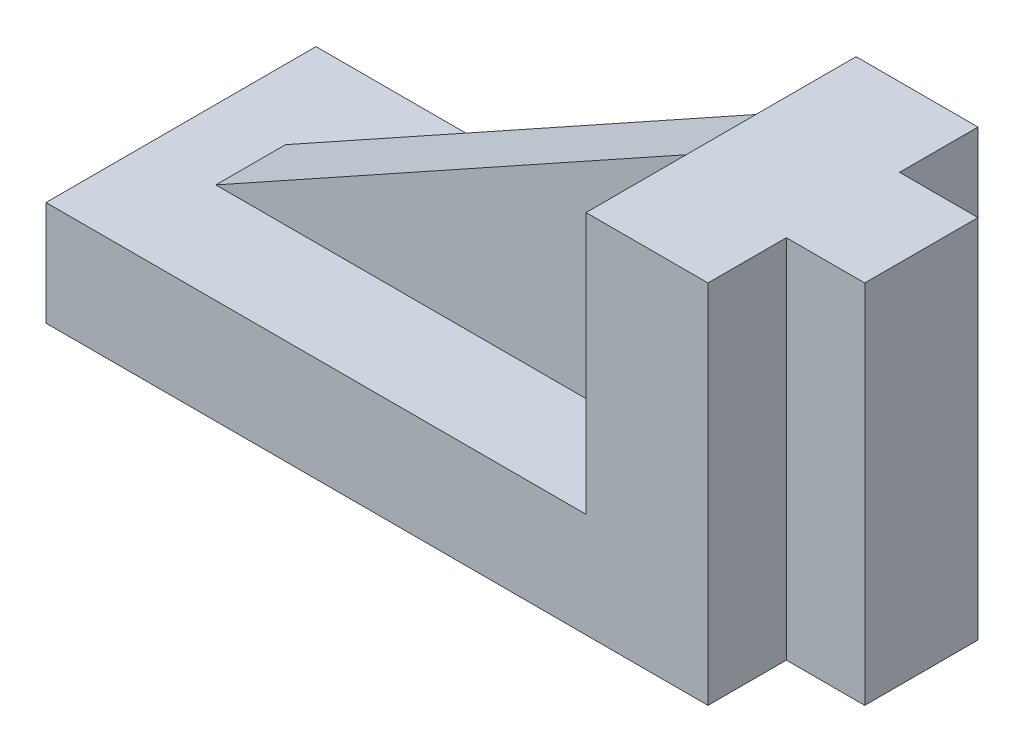
ISO-10303-21;
HEADER;
FILE_DESCRIPTION(('STEP AP214'),'2;1');
FILE_NAME('part.step','',(''),(''),'','','');
FILE_SCHEMA(('AUTOMOTIVE_DESIGN { 1 0 10303 214 1 1 1 1 }'));
ENDSEC;
DATA;
#1=APPLICATION_CONTEXT('core data for automotive mechanical design processes');
#2=APPLICATION_PROTOCOL_DEFINITION('international standard','automotive_design',2000,#1);
#3=PRODUCT_CONTEXT('',#1,'mechanical');
#4=PRODUCT('Part','Part','',(#3));
#5=PRODUCT_RELATED_PRODUCT_CATEGORY('part','',(#4));
#6=PRODUCT_DEFINITION_FORMATION('','',#4);
#7=PRODUCT_DEFINITION_CONTEXT('part definition',#1,'design');
#8=PRODUCT_DEFINITION('design','',#6,#7);
#9=PRODUCT_DEFINITION_SHAPE('','',#8);
#10=(LENGTH_UNIT() NAMED_UNIT(*) SI_UNIT(.MILLI.,.METRE.));
#11=(NAMED_UNIT(*) PLANE_ANGLE_UNIT() SI_UNIT($,.RADIAN.));
#12=(NAMED_UNIT(*) SI_UNIT($,.STERADIAN.) SOLID_ANGLE_UNIT());
#13=UNCERTAINTY_MEASURE_WITH_UNIT(LENGTH_MEASURE(1.E-05),#10,'distance_accuracy_value','');
#14=(GEOMETRIC_REPRESENTATION_CONTEXT(3) GLOBAL_UNCERTAINTY_ASSIGNED_CONTEXT((#13)) GLOBAL_UNIT_ASSIGNED_CONTEXT((#10,
#11,#12)) REPRESENTATION_CONTEXT('',''));
#15=CARTESIAN_POINT('',(0.,0.,0.));
#16=DIRECTION('',(0.,0.,1.));
#17=DIRECTION('',(1.,0.,0.));
#18=AXIS2_PLACEMENT_3D('',#15,#16,#17);
#19=CARTESIAN_POINT('',(76.,42.,15.5));
#20=DIRECTION('',(-1.,0.,0.));
#21=DIRECTION('',(0.,0.,1.));
#22=AXIS2_PLACEMENT_3D('',#19,#20,#21);
#23=PLANE('',#22);
#24=DIRECTION('',(0.,1.,0.));
#25=VECTOR('',#24,1.);
#26=CARTESIAN_POINT('',(76.,0.,-6.5));
#27=LINE('',#26,#25);
#28=CARTESIAN_POINT('',(76.,0.,-6.5));
#29=VERTEX_POINT('',#28);
#30=CARTESIAN_POINT('',(76.,42.,-6.5));
#31=VERTEX_POINT('',#30);
#32=EDGE_CURVE('E260',#29,#31,#27,.T.);
#33=ORIENTED_EDGE('',*,*,#32,.F.);
#34=DIRECTION('',(0.,0.,-1.));
#35=VECTOR('',#34,1.);
#36=CARTESIAN_POINT('',(76.,0.,15.5));
#37=LINE('',#36,#35);
#38=CARTESIAN_POINT('',(76.,0.,-15.5));
#39=VERTEX_POINT('',#38);
#40=EDGE_CURVE('E48',#29,#39,#37,.T.);
#41=ORIENTED_EDGE('',*,*,#40,.T.);
#42=DIRECTION('',(0.,1.,0.));
#43=VECTOR('',#42,1.);
#44=CARTESIAN_POINT('',(76.,42.,-15.5));
#45=LINE('',#44,#43);
#46=CARTESIAN_POINT('',(76.,42.,-15.5));
#47=VERTEX_POINT('',#46);
#48=EDGE_CURVE('E195',#39,#47,#45,.T.);
#49=ORIENTED_EDGE('',*,*,#48,.T.);
#50=DIRECTION('',(0.,0.,-1.));
#51=VECTOR('',#50,1.);
#52=CARTESIAN_POINT('',(76.,42.,15.5));
#53=LINE('',#52,#51);
#54=EDGE_CURVE('E224',#31,#47,#53,.T.);
#55=ORIENTED_EDGE('',*,*,#54,.F.);
#56=EDGE_LOOP('',(#33,#41,#49,#55));
#57=FACE_BOUND('',#56,.T.);
#58=ADVANCED_FACE('F39',(#57),#23,.F.);
#59=CARTESIAN_POINT('',(62.,12.,15.5));
#60=DIRECTION('',(1.,0.,0.));
#61=DIRECTION('',(0.,0.,-1.));
#62=AXIS2_PLACEMENT_3D('',#59,#60,#61);
#63=PLANE('',#62);
#64=DIRECTION('',(0.,1.,0.));
#65=VECTOR('',#64,1.);
#66=CARTESIAN_POINT('',(62.,42.,-4.));
#67=LINE('',#66,#65);
#68=CARTESIAN_POINT('',(62.,12.,-4.));
#69=VERTEX_POINT('',#68);
#70=CARTESIAN_POINT('',(62.,42.,-4.));
#71=VERTEX_POINT('',#70);
#72=EDGE_CURVE('E63',#69,#71,#67,.T.);
#73=ORIENTED_EDGE('',*,*,#72,.T.);
#74=DIRECTION('',(0.,0.,-1.));
#75=VECTOR('',#74,1.);
#76=CARTESIAN_POINT('',(62.,42.,15.5));
#77=LINE('',#76,#75);
#78=CARTESIAN_POINT('',(62.,42.,-15.5));
#79=VERTEX_POINT('',#78);
#80=EDGE_CURVE('E220',#71,#79,#77,.T.);
#81=ORIENTED_EDGE('',*,*,#80,.T.);
#82=DIRECTION('',(0.,-1.,0.));
#83=VECTOR('',#82,1.);
#84=CARTESIAN_POINT('',(62.,12.,-15.5));
#85=LINE('',#84,#83);
#86=CARTESIAN_POINT('',(62.,12.,-15.5));
#87=VERTEX_POINT('',#86);
#88=EDGE_CURVE('E203',#79,#87,#85,.T.);
#89=ORIENTED_EDGE('',*,*,#88,.T.);
#90=DIRECTION('',(0.,0.,-1.));
#91=VECTOR('',#90,1.);
#92=CARTESIAN_POINT('',(62.,12.,15.5));
#93=LINE('',#92,#91);
#94=EDGE_CURVE('E215',#69,#87,#93,.T.);
#95=ORIENTED_EDGE('',*,*,#94,.F.);
#96=EDGE_LOOP('',(#73,#81,#89,#95));
#97=FACE_BOUND('',#96,.T.);
#98=ADVANCED_FACE('F245',(#97),#63,.F.);
#99=CARTESIAN_POINT('',(76.,0.,15.5));
#100=DIRECTION('',(0.,1.,0.));
#101=DIRECTION('',(-1.,0.,0.));
#102=AXIS2_PLACEMENT_3D('',#99,#100,#101);
#103=PLANE('',#102);
#104=DIRECTION('',(1.,0.,0.));
#105=VECTOR('',#104,1.);
#106=CARTESIAN_POINT('',(76.,0.,-15.5));
#107=LINE('',#106,#105);
#108=CARTESIAN_POINT('',(0.,0.,-15.5));
#109=VERTEX_POINT('',#108);
#110=EDGE_CURVE('E192',#109,#39,#107,.T.);
#111=ORIENTED_EDGE('',*,*,#110,.T.);
#112=ORIENTED_EDGE('',*,*,#40,.F.);
#113=DIRECTION('',(-1.,0.,0.));
#114=VECTOR('',#113,1.);
#115=CARTESIAN_POINT('',(76.,0.,-6.5));
#116=LINE('',#115,#114);
#117=CARTESIAN_POINT('',(85.,0.,-6.5));
#118=VERTEX_POINT('',#117);
#119=EDGE_CURVE('E143',#118,#29,#116,.T.);
#120=ORIENTED_EDGE('',*,*,#119,.F.);
#121=DIRECTION('',(0.,0.,-1.));
#122=VECTOR('',#121,1.);
#123=CARTESIAN_POINT('',(85.,0.,-6.5));
#124=LINE('',#123,#122);
#125=CARTESIAN_POINT('',(85.,0.,6.5));
#126=VERTEX_POINT('',#125);
#127=EDGE_CURVE('E152',#126,#118,#124,.T.);
#128=ORIENTED_EDGE('',*,*,#127,.F.);
#129=DIRECTION('',(1.,0.,0.));
#130=VECTOR('',#129,1.);
#131=CARTESIAN_POINT('',(76.,0.,6.5));
#132=LINE('',#131,#130);
#133=CARTESIAN_POINT('',(76.,0.,6.5));
#134=VERTEX_POINT('',#133);
#135=EDGE_CURVE('E137',#134,#126,#132,.T.);
#136=ORIENTED_EDGE('',*,*,#135,.F.);
#137=CARTESIAN_POINT('',(76.,0.,15.5));
#138=VERTEX_POINT('',#137);
#139=EDGE_CURVE('E11',#138,#134,#37,.T.);
#140=ORIENTED_EDGE('',*,*,#139,.F.);
#141=DIRECTION('',(1.,0.,0.));
#142=VECTOR('',#141,1.);
#143=CARTESIAN_POINT('',(76.,0.,15.5));
#144=LINE('',#143,#142);
#145=CARTESIAN_POINT('',(0.,0.,15.5));
#146=VERTEX_POINT('',#145);
#147=EDGE_CURVE('E164',#146,#138,#144,.T.);
#148=ORIENTED_EDGE('',*,*,#147,.F.);
#149=DIRECTION('',(0.,0.,-1.));
#150=VECTOR('',#149,1.);
#151=CARTESIAN_POINT('',(0.,0.,15.5));
#152=LINE('',#151,#150);
#153=EDGE_CURVE('E191',#146,#109,#152,.T.);
#154=ORIENTED_EDGE('',*,*,#153,.T.);
#155=EDGE_LOOP('',(#111,#112,#120,#128,#136,#140,#148,#154));
#156=FACE_BOUND('',#155,.T.);
#157=ADVANCED_FACE('F41',(#156),#103,.F.);
#158=ORIENTED_EDGE('',*,*,#139,.T.);
#159=DIRECTION('',(0.,1.,0.));
#160=VECTOR('',#159,1.);
#161=CARTESIAN_POINT('',(76.,0.,6.5));
#162=LINE('',#161,#160);
#163=CARTESIAN_POINT('',(76.,42.,6.5));
#164=VERTEX_POINT('',#163);
#165=EDGE_CURVE('E134',#134,#164,#162,.T.);
#166=ORIENTED_EDGE('',*,*,#165,.T.);
#167=CARTESIAN_POINT('',(76.,42.,15.5));
#168=VERTEX_POINT('',#167);
#169=EDGE_CURVE('E159',#168,#164,#53,.T.);
#170=ORIENTED_EDGE('',*,*,#169,.F.);
#171=DIRECTION('',(0.,1.,0.));
#172=VECTOR('',#171,1.);
#173=CARTESIAN_POINT('',(76.,42.,15.5));
#174=LINE('',#173,#172);
#175=EDGE_CURVE('E157',#138,#168,#174,.T.);
#176=ORIENTED_EDGE('',*,*,#175,.F.);
#177=EDGE_LOOP('',(#158,#166,#170,#176));
#178=FACE_BOUND('',#177,.T.);
#179=ADVANCED_FACE('F156',(#178),#23,.F.);
#180=CARTESIAN_POINT('',(62.,42.,15.5));
#181=DIRECTION('',(0.,-1.,0.));
#182=DIRECTION('',(0.,0.,-1.));
#183=AXIS2_PLACEMENT_3D('',#180,#181,#182);
#184=PLANE('',#183);
#185=DIRECTION('',(-1.,0.,0.));
#186=VECTOR('',#185,1.);
#187=CARTESIAN_POINT('',(62.,42.,-15.5));
#188=LINE('',#187,#186);
#189=EDGE_CURVE('E199',#47,#79,#188,.T.);
#190=ORIENTED_EDGE('',*,*,#189,.T.);
#191=ORIENTED_EDGE('',*,*,#80,.F.);
#192=DIRECTION('',(0.,0.,-1.));
#193=VECTOR('',#192,1.);
#194=CARTESIAN_POINT('',(62.,42.,4.));
#195=LINE('',#194,#193);
#196=CARTESIAN_POINT('',(62.,42.,4.));
#197=VERTEX_POINT('',#196);
#198=EDGE_CURVE('E178',#197,#71,#195,.T.);
#199=ORIENTED_EDGE('',*,*,#198,.F.);
#200=CARTESIAN_POINT('',(62.,42.,15.5));
#201=VERTEX_POINT('',#200);
#202=EDGE_CURVE('E221',#201,#197,#77,.T.);
#203=ORIENTED_EDGE('',*,*,#202,.F.);
#204=DIRECTION('',(-1.,0.,0.));
#205=VECTOR('',#204,1.);
#206=CARTESIAN_POINT('',(62.,42.,15.5));
#207=LINE('',#206,#205);
#208=EDGE_CURVE('E163',#168,#201,#207,.T.);
#209=ORIENTED_EDGE('',*,*,#208,.F.);
#210=ORIENTED_EDGE('',*,*,#169,.T.);
#211=DIRECTION('',(1.,0.,0.));
#212=VECTOR('',#211,1.);
#213=CARTESIAN_POINT('',(76.,42.,6.5));
#214=LINE('',#213,#212);
#215=CARTESIAN_POINT('',(85.,42.,6.5));
#216=VERTEX_POINT('',#215);
#217=EDGE_CURVE('E55',#164,#216,#214,.T.);
#218=ORIENTED_EDGE('',*,*,#217,.T.);
#219=DIRECTION('',(0.,0.,-1.));
#220=VECTOR('',#219,1.);
#221=CARTESIAN_POINT('',(85.,42.,-6.5));
#222=LINE('',#221,#220);
#223=CARTESIAN_POINT('',(85.,42.,-6.5));
#224=VERTEX_POINT('',#223);
#225=EDGE_CURVE('E293',#216,#224,#222,.T.);
#226=ORIENTED_EDGE('',*,*,#225,.T.);
#227=DIRECTION('',(-1.,0.,0.));
#228=VECTOR('',#227,1.);
#229=CARTESIAN_POINT('',(76.,42.,-6.5));
#230=LINE('',#229,#228);
#231=EDGE_CURVE('E154',#224,#31,#230,.T.);
#232=ORIENTED_EDGE('',*,*,#231,.T.);
#233=ORIENTED_EDGE('',*,*,#54,.T.);
#234=EDGE_LOOP('',(#190,#191,#199,#203,#209,#210,#218,#226,#232,#233));
#235=FACE_BOUND('',#234,.T.);
#236=ADVANCED_FACE('F231',(#235),#184,.F.);
#237=ORIENTED_EDGE('',*,*,#202,.T.);
#238=DIRECTION('',(0.,1.,0.));
#239=VECTOR('',#238,1.);
#240=CARTESIAN_POINT('',(62.,42.,4.));
#241=LINE('',#240,#239);
#242=CARTESIAN_POINT('',(62.,12.,4.));
#243=VERTEX_POINT('',#242);
#244=EDGE_CURVE('E278',#243,#197,#241,.T.);
#245=ORIENTED_EDGE('',*,*,#244,.F.);
#246=CARTESIAN_POINT('',(62.,12.,15.5));
#247=VERTEX_POINT('',#246);
#248=EDGE_CURVE('E216',#247,#243,#93,.T.);
#249=ORIENTED_EDGE('',*,*,#248,.F.);
#250=DIRECTION('',(0.,-1.,0.));
#251=VECTOR('',#250,1.);
#252=CARTESIAN_POINT('',(62.,12.,15.5));
#253=LINE('',#252,#251);
#254=EDGE_CURVE('E183',#201,#247,#253,.T.);
#255=ORIENTED_EDGE('',*,*,#254,.F.);
#256=EDGE_LOOP('',(#237,#245,#249,#255));
#257=FACE_BOUND('',#256,.T.);
#258=ADVANCED_FACE('F321',(#257),#63,.F.);
#259=CARTESIAN_POINT('',(0.,12.,15.5));
#260=DIRECTION('',(0.,-1.,0.));
#261=DIRECTION('',(0.,0.,-1.));
#262=AXIS2_PLACEMENT_3D('',#259,#260,#261);
#263=PLANE('',#262);
#264=ORIENTED_EDGE('',*,*,#248,.T.);
#265=DIRECTION('',(1.,0.,0.));
#266=VECTOR('',#265,1.);
#267=CARTESIAN_POINT('',(62.,12.,4.));
#268=LINE('',#267,#266);
#269=CARTESIAN_POINT('',(8.,12.,4.));
#270=VERTEX_POINT('',#269);
#271=EDGE_CURVE('E273',#270,#243,#268,.T.);
#272=ORIENTED_EDGE('',*,*,#271,.F.);
#273=DIRECTION('',(0.,0.,-1.));
#274=VECTOR('',#273,1.);
#275=CARTESIAN_POINT('',(8.,12.,4.));
#276=LINE('',#275,#274);
#277=CARTESIAN_POINT('',(8.,12.,-4.));
#278=VERTEX_POINT('',#277);
#279=EDGE_CURVE('E255',#270,#278,#276,.T.);
#280=ORIENTED_EDGE('',*,*,#279,.T.);
#281=DIRECTION('',(1.,0.,0.));
#282=VECTOR('',#281,1.);
#283=CARTESIAN_POINT('',(62.,12.,-4.));
#284=LINE('',#283,#282);
#285=EDGE_CURVE('E253',#278,#69,#284,.T.);
#286=ORIENTED_EDGE('',*,*,#285,.T.);
#287=ORIENTED_EDGE('',*,*,#94,.T.);
#288=DIRECTION('',(-1.,0.,0.));
#289=VECTOR('',#288,1.);
#290=CARTESIAN_POINT('',(0.,12.,-15.5));
#291=LINE('',#290,#289);
#292=CARTESIAN_POINT('',(0.,12.,-15.5));
#293=VERTEX_POINT('',#292);
#294=EDGE_CURVE('E175',#87,#293,#291,.T.);
#295=ORIENTED_EDGE('',*,*,#294,.T.);
#296=DIRECTION('',(0.,0.,-1.));
#297=VECTOR('',#296,1.);
#298=CARTESIAN_POINT('',(0.,12.,15.5));
#299=LINE('',#298,#297);
#300=CARTESIAN_POINT('',(0.,12.,15.5));
#301=VERTEX_POINT('',#300);
#302=EDGE_CURVE('E211',#301,#293,#299,.T.);
#303=ORIENTED_EDGE('',*,*,#302,.F.);
#304=DIRECTION('',(-1.,0.,0.));
#305=VECTOR('',#304,1.);
#306=CARTESIAN_POINT('',(0.,12.,15.5));
#307=LINE('',#306,#305);
#308=EDGE_CURVE('E186',#247,#301,#307,.T.);
#309=ORIENTED_EDGE('',*,*,#308,.F.);
#310=EDGE_LOOP('',(#264,#272,#280,#286,#287,#295,#303,#309));
#311=FACE_BOUND('',#310,.T.);
#312=ADVANCED_FACE('F250',(#311),#263,.F.);
#313=CARTESIAN_POINT('',(0.,0.,15.5));
#314=DIRECTION('',(1.,0.,0.));
#315=DIRECTION('',(0.,0.,-1.));
#316=AXIS2_PLACEMENT_3D('',#313,#314,#315);
#317=PLANE('',#316);
#318=DIRECTION('',(0.,-1.,0.));
#319=VECTOR('',#318,1.);
#320=CARTESIAN_POINT('',(0.,0.,-15.5));
#321=LINE('',#320,#319);
#322=EDGE_CURVE('E172',#293,#109,#321,.T.);
#323=ORIENTED_EDGE('',*,*,#322,.T.);
#324=ORIENTED_EDGE('',*,*,#153,.F.);
#325=DIRECTION('',(0.,-1.,0.));
#326=VECTOR('',#325,1.);
#327=CARTESIAN_POINT('',(0.,0.,15.5));
#328=LINE('',#327,#326);
#329=EDGE_CURVE('E168',#301,#146,#328,.T.);
#330=ORIENTED_EDGE('',*,*,#329,.F.);
#331=ORIENTED_EDGE('',*,*,#302,.T.);
#332=EDGE_LOOP('',(#323,#324,#330,#331));
#333=FACE_BOUND('',#332,.T.);
#334=ADVANCED_FACE('F358',(#333),#317,.F.);
#335=CARTESIAN_POINT('',(0.,0.,15.5));
#336=DIRECTION('',(0.,0.,-1.));
#337=DIRECTION('',(-1.,0.,0.));
#338=AXIS2_PLACEMENT_3D('',#335,#336,#337);
#339=PLANE('',#338);
#340=ORIENTED_EDGE('',*,*,#147,.T.);
#341=ORIENTED_EDGE('',*,*,#175,.T.);
#342=ORIENTED_EDGE('',*,*,#208,.T.);
#343=ORIENTED_EDGE('',*,*,#254,.T.);
#344=ORIENTED_EDGE('',*,*,#308,.T.);
#345=ORIENTED_EDGE('',*,*,#329,.T.);
#346=EDGE_LOOP('',(#340,#341,#342,#343,#344,#345));
#347=FACE_BOUND('',#346,.T.);
#348=ADVANCED_FACE('F166',(#347),#339,.F.);
#349=CARTESIAN_POINT('',(0.,0.,-15.5));
#350=DIRECTION('',(0.,0.,-1.));
#351=DIRECTION('',(-1.,0.,0.));
#352=AXIS2_PLACEMENT_3D('',#349,#350,#351);
#353=PLANE('',#352);
#354=ORIENTED_EDGE('',*,*,#110,.F.);
#355=ORIENTED_EDGE('',*,*,#322,.F.);
#356=ORIENTED_EDGE('',*,*,#294,.F.);
#357=ORIENTED_EDGE('',*,*,#88,.F.);
#358=ORIENTED_EDGE('',*,*,#189,.F.);
#359=ORIENTED_EDGE('',*,*,#48,.F.);
#360=EDGE_LOOP('',(#354,#355,#356,#357,#358,#359));
#361=FACE_BOUND('',#360,.T.);
#362=ADVANCED_FACE('F242',(#361),#353,.T.);
#363=CARTESIAN_POINT('',(8.,12.,4.));
#364=DIRECTION('',(0.485642931178632,-0.874157276121538,0.));
#365=DIRECTION('',(0.874157276121538,0.485642931178632,0.));
#366=AXIS2_PLACEMENT_3D('',#363,#364,#365);
#367=PLANE('',#366);
#368=DIRECTION('',(-0.874157276121538,-0.485642931178632,0.));
#369=VECTOR('',#368,1.);
#370=CARTESIAN_POINT('',(8.,12.,-4.));
#371=LINE('',#370,#369);
#372=EDGE_CURVE('E264',#71,#278,#371,.T.);
#373=ORIENTED_EDGE('',*,*,#372,.T.);
#374=ORIENTED_EDGE('',*,*,#279,.F.);
#375=DIRECTION('',(-0.874157276121538,-0.485642931178632,0.));
#376=VECTOR('',#375,1.);
#377=CARTESIAN_POINT('',(8.,12.,4.));
#378=LINE('',#377,#376);
#379=EDGE_CURVE('E269',#197,#270,#378,.T.);
#380=ORIENTED_EDGE('',*,*,#379,.F.);
#381=ORIENTED_EDGE('',*,*,#198,.T.);
#382=EDGE_LOOP('',(#373,#374,#380,#381));
#383=FACE_BOUND('',#382,.T.);
#384=ADVANCED_FACE('F365',(#383),#367,.F.);
#385=CARTESIAN_POINT('',(0.,0.,4.));
#386=DIRECTION('',(0.,0.,1.));
#387=DIRECTION('',(1.,0.,0.));
#388=AXIS2_PLACEMENT_3D('',#385,#386,#387);
#389=PLANE('',#388);
#390=ORIENTED_EDGE('',*,*,#271,.T.);
#391=ORIENTED_EDGE('',*,*,#244,.T.);
#392=ORIENTED_EDGE('',*,*,#379,.T.);
#393=EDGE_LOOP('',(#390,#391,#392));
#394=FACE_BOUND('',#393,.T.);
#395=ADVANCED_FACE('F314',(#394),#389,.T.);
#396=CARTESIAN_POINT('',(0.,0.,-4.));
#397=DIRECTION('',(0.,0.,1.));
#398=DIRECTION('',(1.,0.,0.));
#399=AXIS2_PLACEMENT_3D('',#396,#397,#398);
#400=PLANE('',#399);
#401=ORIENTED_EDGE('',*,*,#285,.F.);
#402=ORIENTED_EDGE('',*,*,#372,.F.);
#403=ORIENTED_EDGE('',*,*,#72,.F.);
#404=EDGE_LOOP('',(#401,#402,#403));
#405=FACE_BOUND('',#404,.T.);
#406=ADVANCED_FACE('F307',(#405),#400,.F.);
#407=CARTESIAN_POINT('',(76.,0.,-6.5));
#408=DIRECTION('',(0.,0.,-1.));
#409=DIRECTION('',(-1.,0.,0.));
#410=AXIS2_PLACEMENT_3D('',#407,#408,#409);
#411=PLANE('',#410);
#412=ORIENTED_EDGE('',*,*,#231,.F.);
#413=DIRECTION('',(0.,1.,0.));
#414=VECTOR('',#413,1.);
#415=CARTESIAN_POINT('',(85.,0.,-6.5));
#416=LINE('',#415,#414);
#417=EDGE_CURVE('E266',#118,#224,#416,.T.);
#418=ORIENTED_EDGE('',*,*,#417,.F.);
#419=ORIENTED_EDGE('',*,*,#119,.T.);
#420=ORIENTED_EDGE('',*,*,#32,.T.);
#421=EDGE_LOOP('',(#412,#418,#419,#420));
#422=FACE_BOUND('',#421,.T.);
#423=ADVANCED_FACE('F305',(#422),#411,.T.);
#424=CARTESIAN_POINT('',(85.,0.,-6.5));
#425=DIRECTION('',(1.,0.,0.));
#426=DIRECTION('',(0.,0.,-1.));
#427=AXIS2_PLACEMENT_3D('',#424,#425,#426);
#428=PLANE('',#427);
#429=ORIENTED_EDGE('',*,*,#225,.F.);
#430=DIRECTION('',(0.,1.,0.));
#431=VECTOR('',#430,1.);
#432=CARTESIAN_POINT('',(85.,0.,6.5));
#433=LINE('',#432,#431);
#434=EDGE_CURVE('E142',#126,#216,#433,.T.);
#435=ORIENTED_EDGE('',*,*,#434,.F.);
#436=ORIENTED_EDGE('',*,*,#127,.T.);
#437=ORIENTED_EDGE('',*,*,#417,.T.);
#438=EDGE_LOOP('',(#429,#435,#436,#437));
#439=FACE_BOUND('',#438,.T.);
#440=ADVANCED_FACE('F303',(#439),#428,.T.);
#441=CARTESIAN_POINT('',(76.,0.,6.5));
#442=DIRECTION('',(0.,0.,1.));
#443=DIRECTION('',(1.,0.,0.));
#444=AXIS2_PLACEMENT_3D('',#441,#442,#443);
#445=PLANE('',#444);
#446=ORIENTED_EDGE('',*,*,#217,.F.);
#447=ORIENTED_EDGE('',*,*,#165,.F.);
#448=ORIENTED_EDGE('',*,*,#135,.T.);
#449=ORIENTED_EDGE('',*,*,#434,.T.);
#450=EDGE_LOOP('',(#446,#447,#448,#449));
#451=FACE_BOUND('',#450,.T.);
#452=ADVANCED_FACE('F136',(#451),#445,.T.);
#453=CLOSED_SHELL('',(#58,#98,#157,#179,#236,#258,#312,#334,#348,#362,#384,#395,#406,#423,#440,#452));
#454=MANIFOLD_SOLID_BREP('B2',#453);
#455=ADVANCED_BREP_SHAPE_REPRESENTATION('',(#18,#454),#14);
#456=SHAPE_DEFINITION_REPRESENTATION(#9,#455);
ENDSEC;
END-ISO-10303-21;
